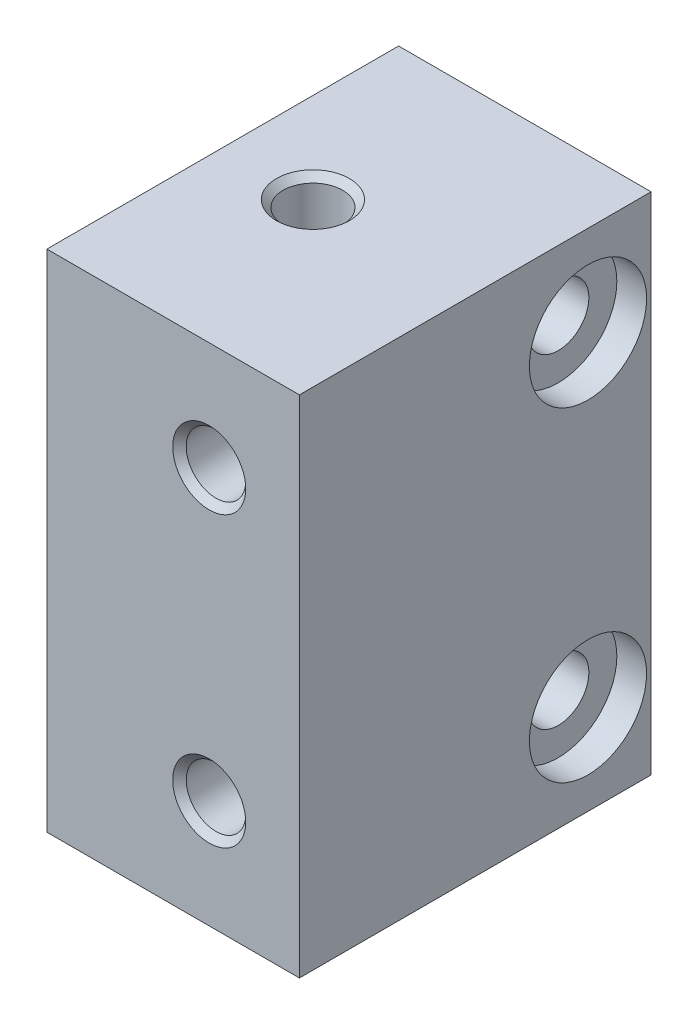
ISO-10303-21;
HEADER;
FILE_DESCRIPTION(('STEP AP214'),'2;1');
FILE_NAME('part.step','',(''),(''),'','','');
FILE_SCHEMA(('AUTOMOTIVE_DESIGN { 1 0 10303 214 1 1 1 1 }'));
ENDSEC;
DATA;
#1=APPLICATION_CONTEXT('core data for automotive mechanical design processes');
#2=APPLICATION_PROTOCOL_DEFINITION('international standard','automotive_design',2000,#1);
#3=PRODUCT_CONTEXT('',#1,'mechanical');
#4=PRODUCT('Part','Part','',(#3));
#5=PRODUCT_RELATED_PRODUCT_CATEGORY('part','',(#4));
#6=PRODUCT_DEFINITION_FORMATION('','',#4);
#7=PRODUCT_DEFINITION_CONTEXT('part definition',#1,'design');
#8=PRODUCT_DEFINITION('design','',#6,#7);
#9=PRODUCT_DEFINITION_SHAPE('','',#8);
#10=(LENGTH_UNIT() NAMED_UNIT(*) SI_UNIT(.MILLI.,.METRE.));
#11=(NAMED_UNIT(*) PLANE_ANGLE_UNIT() SI_UNIT($,.RADIAN.));
#12=(NAMED_UNIT(*) SI_UNIT($,.STERADIAN.) SOLID_ANGLE_UNIT());
#13=UNCERTAINTY_MEASURE_WITH_UNIT(LENGTH_MEASURE(1.E-05),#10,'distance_accuracy_value','');
#14=(GEOMETRIC_REPRESENTATION_CONTEXT(3) GLOBAL_UNCERTAINTY_ASSIGNED_CONTEXT((#13)) GLOBAL_UNIT_ASSIGNED_CONTEXT((#10,
#11,#12)) REPRESENTATION_CONTEXT('',''));
#15=CARTESIAN_POINT('',(0.,0.,0.));
#16=DIRECTION('',(0.,0.,1.));
#17=DIRECTION('',(1.,0.,0.));
#18=AXIS2_PLACEMENT_3D('',#15,#16,#17);
#19=CARTESIAN_POINT('',(21.9050122291573,-14.0022091203632,19.5));
#20=DIRECTION('',(-1.,0.,0.));
#21=DIRECTION('',(0.,0.,1.));
#22=AXIS2_PLACEMENT_3D('',#19,#20,#21);
#23=PLANE('',#22);
#24=CARTESIAN_POINT('',(21.9050122291573,-9.00220912036323,3.5));
#25=DIRECTION('',(1.,0.,0.));
#26=DIRECTION('',(0.,0.,-1.));
#27=AXIS2_PLACEMENT_3D('',#24,#25,#26);
#28=CIRCLE('',#27,3.25);
#29=CARTESIAN_POINT('',(21.9050122291573,-9.00220912036323,0.250000000000004));
#30=VERTEX_POINT('',#29);
#31=EDGE_CURVE('E127',#30,#30,#28,.T.);
#32=ORIENTED_EDGE('',*,*,#31,.F.);
#33=EDGE_LOOP('',(#32));
#34=FACE_BOUND('',#33,.T.);
#35=DIRECTION('',(0.,1.,0.));
#36=VECTOR('',#35,1.);
#37=CARTESIAN_POINT('',(21.9050122291573,-14.0022091203632,0.));
#38=LINE('',#37,#36);
#39=CARTESIAN_POINT('',(21.9050122291573,-14.0022091203632,0.));
#40=VERTEX_POINT('',#39);
#41=CARTESIAN_POINT('',(21.9050122291573,13.9977908796368,0.));
#42=VERTEX_POINT('',#41);
#43=EDGE_CURVE('E139',#40,#42,#38,.T.);
#44=ORIENTED_EDGE('',*,*,#43,.T.);
#45=DIRECTION('',(0.,0.,-1.));
#46=VECTOR('',#45,1.);
#47=CARTESIAN_POINT('',(21.9050122291573,13.9977908796368,19.5));
#48=LINE('',#47,#46);
#49=CARTESIAN_POINT('',(21.9050122291573,13.9977908796368,19.5));
#50=VERTEX_POINT('',#49);
#51=EDGE_CURVE('E11',#50,#42,#48,.T.);
#52=ORIENTED_EDGE('',*,*,#51,.F.);
#53=DIRECTION('',(0.,1.,0.));
#54=VECTOR('',#53,1.);
#55=CARTESIAN_POINT('',(21.9050122291573,-14.0022091203632,19.5));
#56=LINE('',#55,#54);
#57=CARTESIAN_POINT('',(21.9050122291573,-14.0022091203632,19.5));
#58=VERTEX_POINT('',#57);
#59=EDGE_CURVE('E140',#58,#50,#56,.T.);
#60=ORIENTED_EDGE('',*,*,#59,.F.);
#61=DIRECTION('',(0.,0.,-1.));
#62=VECTOR('',#61,1.);
#63=CARTESIAN_POINT('',(21.9050122291573,-14.0022091203632,19.5));
#64=LINE('',#63,#62);
#65=EDGE_CURVE('E146',#58,#40,#64,.T.);
#66=ORIENTED_EDGE('',*,*,#65,.T.);
#67=EDGE_LOOP('',(#44,#52,#60,#66));
#68=FACE_BOUND('',#67,.T.);
#69=CARTESIAN_POINT('',(21.9050122291573,8.99779087963678,3.5));
#70=DIRECTION('',(1.,0.,0.));
#71=DIRECTION('',(0.,0.,-1.));
#72=AXIS2_PLACEMENT_3D('',#69,#70,#71);
#73=CIRCLE('',#72,3.25);
#74=CARTESIAN_POINT('',(21.9050122291573,8.99779087963678,0.250000000000007));
#75=VERTEX_POINT('',#74);
#76=EDGE_CURVE('E115',#75,#75,#73,.T.);
#77=ORIENTED_EDGE('',*,*,#76,.F.);
#78=EDGE_LOOP('',(#77));
#79=FACE_BOUND('',#78,.T.);
#80=ADVANCED_FACE('F35',(#34,#68,#79),#23,.F.);
#81=CARTESIAN_POINT('',(21.9050122291573,13.9977908796368,19.5));
#82=DIRECTION('',(0.,-1.,0.));
#83=DIRECTION('',(1.,0.,0.));
#84=AXIS2_PLACEMENT_3D('',#81,#82,#83);
#85=PLANE('',#84);
#86=CARTESIAN_POINT('',(12.9050122291573,13.9977908796368,9.75));
#87=DIRECTION('',(0.,1.,0.));
#88=DIRECTION('',(0.,0.,1.));
#89=AXIS2_PLACEMENT_3D('',#86,#87,#88);
#90=CIRCLE('',#89,2.025);
#91=CARTESIAN_POINT('',(12.9050122291573,13.9977908796368,11.775));
#92=VERTEX_POINT('',#91);
#93=EDGE_CURVE('E363',#92,#92,#90,.T.);
#94=ORIENTED_EDGE('',*,*,#93,.F.);
#95=EDGE_LOOP('',(#94));
#96=FACE_BOUND('',#95,.T.);
#97=DIRECTION('',(-1.,0.,0.));
#98=VECTOR('',#97,1.);
#99=CARTESIAN_POINT('',(21.9050122291573,13.9977908796368,0.));
#100=LINE('',#99,#98);
#101=CARTESIAN_POINT('',(7.90501222915729,13.9977908796368,0.));
#102=VERTEX_POINT('',#101);
#103=EDGE_CURVE('E149',#42,#102,#100,.T.);
#104=ORIENTED_EDGE('',*,*,#103,.T.);
#105=DIRECTION('',(0.,0.,-1.));
#106=VECTOR('',#105,1.);
#107=CARTESIAN_POINT('',(7.90501222915729,13.9977908796368,19.5));
#108=LINE('',#107,#106);
#109=CARTESIAN_POINT('',(7.90501222915729,13.9977908796368,19.5));
#110=VERTEX_POINT('',#109);
#111=EDGE_CURVE('E43',#110,#102,#108,.T.);
#112=ORIENTED_EDGE('',*,*,#111,.F.);
#113=DIRECTION('',(-1.,0.,0.));
#114=VECTOR('',#113,1.);
#115=CARTESIAN_POINT('',(21.9050122291573,13.9977908796368,19.5));
#116=LINE('',#115,#114);
#117=EDGE_CURVE('E82',#50,#110,#116,.T.);
#118=ORIENTED_EDGE('',*,*,#117,.F.);
#119=ORIENTED_EDGE('',*,*,#51,.T.);
#120=EDGE_LOOP('',(#104,#112,#118,#119));
#121=FACE_BOUND('',#120,.T.);
#122=ADVANCED_FACE('F175',(#96,#121),#85,.F.);
#123=CARTESIAN_POINT('',(7.90501222915729,-14.0022091203632,19.5));
#124=DIRECTION('',(1.,0.,0.));
#125=DIRECTION('',(0.,1.,0.));
#126=AXIS2_PLACEMENT_3D('',#123,#124,#125);
#127=PLANE('',#126);
#128=CARTESIAN_POINT('',(7.90501222915729,8.99779087963678,3.5));
#129=DIRECTION('',(1.,0.,0.));
#130=DIRECTION('',(0.,1.,0.));
#131=AXIS2_PLACEMENT_3D('',#128,#129,#130);
#132=CIRCLE('',#131,1.7);
#133=CARTESIAN_POINT('',(7.90501222915729,10.6977908796368,3.5));
#134=VERTEX_POINT('',#133);
#135=EDGE_CURVE('E124',#134,#134,#132,.T.);
#136=ORIENTED_EDGE('',*,*,#135,.T.);
#137=EDGE_LOOP('',(#136));
#138=FACE_BOUND('',#137,.T.);
#139=CARTESIAN_POINT('',(7.90501222915729,-9.00220912036323,3.5));
#140=DIRECTION('',(1.,0.,0.));
#141=DIRECTION('',(0.,1.,0.));
#142=AXIS2_PLACEMENT_3D('',#139,#140,#141);
#143=CIRCLE('',#142,1.7);
#144=CARTESIAN_POINT('',(7.90501222915729,-7.30220912036323,3.5));
#145=VERTEX_POINT('',#144);
#146=EDGE_CURVE('E136',#145,#145,#143,.T.);
#147=ORIENTED_EDGE('',*,*,#146,.T.);
#148=EDGE_LOOP('',(#147));
#149=FACE_BOUND('',#148,.T.);
#150=DIRECTION('',(0.,-1.,0.));
#151=VECTOR('',#150,1.);
#152=CARTESIAN_POINT('',(7.90501222915729,-14.0022091203632,0.));
#153=LINE('',#152,#151);
#154=CARTESIAN_POINT('',(7.90501222915729,-14.0022091203632,0.));
#155=VERTEX_POINT('',#154);
#156=EDGE_CURVE('E69',#102,#155,#153,.T.);
#157=ORIENTED_EDGE('',*,*,#156,.T.);
#158=DIRECTION('',(0.,0.,-1.));
#159=VECTOR('',#158,1.);
#160=CARTESIAN_POINT('',(7.90501222915729,-14.0022091203632,19.5));
#161=LINE('',#160,#159);
#162=CARTESIAN_POINT('',(7.90501222915729,-14.0022091203632,19.5));
#163=VERTEX_POINT('',#162);
#164=EDGE_CURVE('E154',#163,#155,#161,.T.);
#165=ORIENTED_EDGE('',*,*,#164,.F.);
#166=DIRECTION('',(0.,-1.,0.));
#167=VECTOR('',#166,1.);
#168=CARTESIAN_POINT('',(7.90501222915729,-14.0022091203632,19.5));
#169=LINE('',#168,#167);
#170=EDGE_CURVE('E143',#110,#163,#169,.T.);
#171=ORIENTED_EDGE('',*,*,#170,.F.);
#172=ORIENTED_EDGE('',*,*,#111,.T.);
#173=EDGE_LOOP('',(#157,#165,#171,#172));
#174=FACE_BOUND('',#173,.T.);
#175=ADVANCED_FACE('F156',(#138,#149,#174),#127,.F.);
#176=CARTESIAN_POINT('',(21.9050122291573,-14.0022091203632,19.5));
#177=DIRECTION('',(0.,1.,0.));
#178=DIRECTION('',(-1.,0.,0.));
#179=AXIS2_PLACEMENT_3D('',#176,#177,#178);
#180=PLANE('',#179);
#181=CARTESIAN_POINT('',(12.9050122291573,-14.0022091203632,9.75));
#182=DIRECTION('',(0.,1.,0.));
#183=DIRECTION('',(0.,0.,1.));
#184=AXIS2_PLACEMENT_3D('',#181,#182,#183);
#185=CIRCLE('',#184,2.02499999999999);
#186=CARTESIAN_POINT('',(12.9050122291573,-14.0022091203632,11.775));
#187=VERTEX_POINT('',#186);
#188=EDGE_CURVE('E364',#187,#187,#185,.T.);
#189=ORIENTED_EDGE('',*,*,#188,.T.);
#190=EDGE_LOOP('',(#189));
#191=FACE_BOUND('',#190,.T.);
#192=DIRECTION('',(1.,0.,0.));
#193=VECTOR('',#192,1.);
#194=CARTESIAN_POINT('',(21.9050122291573,-14.0022091203632,0.));
#195=LINE('',#194,#193);
#196=EDGE_CURVE('E75',#155,#40,#195,.T.);
#197=ORIENTED_EDGE('',*,*,#196,.T.);
#198=ORIENTED_EDGE('',*,*,#65,.F.);
#199=DIRECTION('',(1.,0.,0.));
#200=VECTOR('',#199,1.);
#201=CARTESIAN_POINT('',(21.9050122291573,-14.0022091203632,19.5));
#202=LINE('',#201,#200);
#203=EDGE_CURVE('E51',#163,#58,#202,.T.);
#204=ORIENTED_EDGE('',*,*,#203,.F.);
#205=ORIENTED_EDGE('',*,*,#164,.T.);
#206=EDGE_LOOP('',(#197,#198,#204,#205));
#207=FACE_BOUND('',#206,.T.);
#208=ADVANCED_FACE('F164',(#191,#207),#180,.F.);
#209=CARTESIAN_POINT('',(0.,0.,19.5));
#210=DIRECTION('',(0.,0.,1.));
#211=DIRECTION('',(1.,0.,0.));
#212=AXIS2_PLACEMENT_3D('',#209,#210,#211);
#213=PLANE('',#212);
#214=CARTESIAN_POINT('',(16.9050122291573,7.99779087963677,19.5));
#215=DIRECTION('',(0.,0.,1.));
#216=DIRECTION('',(1.,0.,0.));
#217=AXIS2_PLACEMENT_3D('',#214,#215,#216);
#218=CIRCLE('',#217,2.025);
#219=CARTESIAN_POINT('',(18.9300122291573,7.99779087963677,19.5));
#220=VERTEX_POINT('',#219);
#221=EDGE_CURVE('E106',#220,#220,#218,.T.);
#222=ORIENTED_EDGE('',*,*,#221,.F.);
#223=EDGE_LOOP('',(#222));
#224=FACE_BOUND('',#223,.T.);
#225=CARTESIAN_POINT('',(16.9050122291573,-8.00220912036323,19.5));
#226=DIRECTION('',(0.,0.,1.));
#227=DIRECTION('',(1.,0.,0.));
#228=AXIS2_PLACEMENT_3D('',#225,#226,#227);
#229=CIRCLE('',#228,2.025);
#230=CARTESIAN_POINT('',(18.9300122291573,-8.00220912036323,19.5));
#231=VERTEX_POINT('',#230);
#232=EDGE_CURVE('E99',#231,#231,#229,.T.);
#233=ORIENTED_EDGE('',*,*,#232,.F.);
#234=EDGE_LOOP('',(#233));
#235=FACE_BOUND('',#234,.T.);
#236=ORIENTED_EDGE('',*,*,#59,.T.);
#237=ORIENTED_EDGE('',*,*,#117,.T.);
#238=ORIENTED_EDGE('',*,*,#170,.T.);
#239=ORIENTED_EDGE('',*,*,#203,.T.);
#240=EDGE_LOOP('',(#236,#237,#238,#239));
#241=FACE_BOUND('',#240,.T.);
#242=ADVANCED_FACE('F166',(#224,#235,#241),#213,.T.);
#243=CARTESIAN_POINT('',(0.,0.,0.));
#244=DIRECTION('',(0.,0.,1.));
#245=DIRECTION('',(1.,0.,0.));
#246=AXIS2_PLACEMENT_3D('',#243,#244,#245);
#247=PLANE('',#246);
#248=ORIENTED_EDGE('',*,*,#43,.F.);
#249=ORIENTED_EDGE('',*,*,#196,.F.);
#250=ORIENTED_EDGE('',*,*,#156,.F.);
#251=ORIENTED_EDGE('',*,*,#103,.F.);
#252=EDGE_LOOP('',(#248,#249,#250,#251));
#253=FACE_BOUND('',#252,.T.);
#254=ADVANCED_FACE('F159',(#253),#247,.F.);
#255=CARTESIAN_POINT('',(21.9050122291573,-9.00220912036323,3.5));
#256=DIRECTION('',(1.,0.,0.));
#257=DIRECTION('',(0.,0.,-1.));
#258=AXIS2_PLACEMENT_3D('',#255,#256,#257);
#259=CYLINDRICAL_SURFACE('',#258,1.7);
#260=ORIENTED_EDGE('',*,*,#146,.F.);
#261=EDGE_LOOP('',(#260));
#262=FACE_BOUND('',#261,.T.);
#263=CARTESIAN_POINT('',(20.2550122291573,-9.00220912036323,3.5));
#264=DIRECTION('',(1.,0.,0.));
#265=DIRECTION('',(0.,0.,-1.));
#266=AXIS2_PLACEMENT_3D('',#263,#264,#265);
#267=CIRCLE('',#266,1.7);
#268=CARTESIAN_POINT('',(20.2550122291573,-9.00220912036323,1.8));
#269=VERTEX_POINT('',#268);
#270=EDGE_CURVE('E133',#269,#269,#267,.T.);
#271=ORIENTED_EDGE('',*,*,#270,.T.);
#272=EDGE_LOOP('',(#271));
#273=FACE_BOUND('',#272,.T.);
#274=ADVANCED_FACE('F201',(#262,#273),#259,.F.);
#275=CARTESIAN_POINT('',(20.2550122291573,-7.30220912036323,3.5));
#276=DIRECTION('',(-1.,0.,0.));
#277=DIRECTION('',(0.,0.,1.));
#278=AXIS2_PLACEMENT_3D('',#275,#276,#277);
#279=PLANE('',#278);
#280=ORIENTED_EDGE('',*,*,#270,.F.);
#281=EDGE_LOOP('',(#280));
#282=FACE_BOUND('',#281,.T.);
#283=CARTESIAN_POINT('',(20.2550122291573,-9.00220912036323,3.5));
#284=DIRECTION('',(1.,0.,0.));
#285=DIRECTION('',(0.,0.,-1.));
#286=AXIS2_PLACEMENT_3D('',#283,#284,#285);
#287=CIRCLE('',#286,3.25);
#288=CARTESIAN_POINT('',(20.2550122291573,-9.00220912036323,0.250000000000004));
#289=VERTEX_POINT('',#288);
#290=EDGE_CURVE('E130',#289,#289,#287,.T.);
#291=ORIENTED_EDGE('',*,*,#290,.T.);
#292=EDGE_LOOP('',(#291));
#293=FACE_BOUND('',#292,.T.);
#294=ADVANCED_FACE('F191',(#282,#293),#279,.F.);
#295=CARTESIAN_POINT('',(21.9050122291573,-9.00220912036323,3.5));
#296=DIRECTION('',(1.,0.,0.));
#297=DIRECTION('',(0.,0.,-1.));
#298=AXIS2_PLACEMENT_3D('',#295,#296,#297);
#299=CYLINDRICAL_SURFACE('',#298,3.25);
#300=ORIENTED_EDGE('',*,*,#290,.F.);
#301=EDGE_LOOP('',(#300));
#302=FACE_BOUND('',#301,.T.);
#303=ORIENTED_EDGE('',*,*,#31,.T.);
#304=EDGE_LOOP('',(#303));
#305=FACE_BOUND('',#304,.T.);
#306=ADVANCED_FACE('F188',(#302,#305),#299,.F.);
#307=CARTESIAN_POINT('',(21.9050122291573,8.99779087963678,3.5));
#308=DIRECTION('',(1.,0.,0.));
#309=DIRECTION('',(0.,0.,-1.));
#310=AXIS2_PLACEMENT_3D('',#307,#308,#309);
#311=CYLINDRICAL_SURFACE('',#310,1.7);
#312=ORIENTED_EDGE('',*,*,#135,.F.);
#313=EDGE_LOOP('',(#312));
#314=FACE_BOUND('',#313,.T.);
#315=CARTESIAN_POINT('',(20.2550122291573,8.99779087963678,3.5));
#316=DIRECTION('',(1.,0.,0.));
#317=DIRECTION('',(0.,0.,-1.));
#318=AXIS2_PLACEMENT_3D('',#315,#316,#317);
#319=CIRCLE('',#318,1.7);
#320=CARTESIAN_POINT('',(20.2550122291573,8.99779087963678,1.8));
#321=VERTEX_POINT('',#320);
#322=EDGE_CURVE('E121',#321,#321,#319,.T.);
#323=ORIENTED_EDGE('',*,*,#322,.T.);
#324=EDGE_LOOP('',(#323));
#325=FACE_BOUND('',#324,.T.);
#326=ADVANCED_FACE('F190',(#314,#325),#311,.F.);
#327=CARTESIAN_POINT('',(20.2550122291573,10.6977908796368,3.5));
#328=DIRECTION('',(-1.,0.,0.));
#329=DIRECTION('',(0.,0.,1.));
#330=AXIS2_PLACEMENT_3D('',#327,#328,#329);
#331=PLANE('',#330);
#332=ORIENTED_EDGE('',*,*,#322,.F.);
#333=EDGE_LOOP('',(#332));
#334=FACE_BOUND('',#333,.T.);
#335=CARTESIAN_POINT('',(20.2550122291573,8.99779087963678,3.5));
#336=DIRECTION('',(1.,0.,0.));
#337=DIRECTION('',(0.,0.,-1.));
#338=AXIS2_PLACEMENT_3D('',#335,#336,#337);
#339=CIRCLE('',#338,3.25);
#340=CARTESIAN_POINT('',(20.2550122291573,8.99779087963678,0.250000000000007));
#341=VERTEX_POINT('',#340);
#342=EDGE_CURVE('E118',#341,#341,#339,.T.);
#343=ORIENTED_EDGE('',*,*,#342,.T.);
#344=EDGE_LOOP('',(#343));
#345=FACE_BOUND('',#344,.T.);
#346=ADVANCED_FACE('F198',(#334,#345),#331,.F.);
#347=CARTESIAN_POINT('',(21.9050122291573,8.99779087963678,3.5));
#348=DIRECTION('',(1.,0.,0.));
#349=DIRECTION('',(0.,0.,-1.));
#350=AXIS2_PLACEMENT_3D('',#347,#348,#349);
#351=CYLINDRICAL_SURFACE('',#350,3.25);
#352=ORIENTED_EDGE('',*,*,#342,.F.);
#353=EDGE_LOOP('',(#352));
#354=FACE_BOUND('',#353,.T.);
#355=ORIENTED_EDGE('',*,*,#76,.T.);
#356=EDGE_LOOP('',(#355));
#357=FACE_BOUND('',#356,.T.);
#358=ADVANCED_FACE('F242',(#354,#357),#351,.F.);
#359=CARTESIAN_POINT('',(16.9050122291573,-8.00220912036323,8.));
#360=DIRECTION('',(0.,0.,1.));
#361=DIRECTION('',(1.,0.,0.));
#362=AXIS2_PLACEMENT_3D('',#359,#360,#361);
#363=CONICAL_SURFACE('',#362,1.65,1.02974425867665);
#364=CARTESIAN_POINT('',(16.9050122291573,-8.00220912036323,7.00857997860452));
#365=VERTEX_POINT('',#364);
#366=VERTEX_LOOP('',#365);
#367=FACE_BOUND('',#366,.T.);
#368=CARTESIAN_POINT('',(16.9050122291573,-8.00220912036323,8.));
#369=DIRECTION('',(0.,0.,1.));
#370=DIRECTION('',(1.,0.,0.));
#371=AXIS2_PLACEMENT_3D('',#368,#369,#370);
#372=CIRCLE('',#371,1.65);
#373=CARTESIAN_POINT('',(18.5550122291573,-8.00220912036323,8.));
#374=VERTEX_POINT('',#373);
#375=EDGE_CURVE('E112',#374,#374,#372,.T.);
#376=ORIENTED_EDGE('',*,*,#375,.T.);
#377=EDGE_LOOP('',(#376));
#378=FACE_BOUND('',#377,.T.);
#379=ADVANCED_FACE('F250',(#367,#378),#363,.F.);
#380=CARTESIAN_POINT('',(16.9050122291573,-8.00220912036323,19.5));
#381=DIRECTION('',(0.,0.,1.));
#382=DIRECTION('',(1.,0.,0.));
#383=AXIS2_PLACEMENT_3D('',#380,#381,#382);
#384=CYLINDRICAL_SURFACE('',#383,1.64999999999999);
#385=ORIENTED_EDGE('',*,*,#375,.F.);
#386=EDGE_LOOP('',(#385));
#387=FACE_BOUND('',#386,.T.);
#388=CARTESIAN_POINT('',(16.9050122291573,-8.00220912036323,19.125));
#389=DIRECTION('',(0.,0.,1.));
#390=DIRECTION('',(1.,0.,0.));
#391=AXIS2_PLACEMENT_3D('',#388,#389,#390);
#392=CIRCLE('',#391,1.64999999999999);
#393=CARTESIAN_POINT('',(18.5550122291573,-8.00220912036323,19.125));
#394=VERTEX_POINT('',#393);
#395=EDGE_CURVE('E103',#394,#394,#392,.T.);
#396=ORIENTED_EDGE('',*,*,#395,.T.);
#397=EDGE_LOOP('',(#396));
#398=FACE_BOUND('',#397,.T.);
#399=ADVANCED_FACE('F266',(#387,#398),#384,.F.);
#400=CARTESIAN_POINT('',(16.9050122291573,-8.00220912036323,19.5));
#401=DIRECTION('',(0.,0.,1.));
#402=DIRECTION('',(1.,0.,0.));
#403=AXIS2_PLACEMENT_3D('',#400,#401,#402);
#404=CONICAL_SURFACE('',#403,2.025,0.785398163397458);
#405=ORIENTED_EDGE('',*,*,#395,.F.);
#406=EDGE_LOOP('',(#405));
#407=FACE_BOUND('',#406,.T.);
#408=ORIENTED_EDGE('',*,*,#232,.T.);
#409=EDGE_LOOP('',(#408));
#410=FACE_BOUND('',#409,.T.);
#411=ADVANCED_FACE('F93',(#407,#410),#404,.F.);
#412=CARTESIAN_POINT('',(16.9050122291573,7.99779087963677,8.));
#413=DIRECTION('',(0.,0.,1.));
#414=DIRECTION('',(1.,0.,0.));
#415=AXIS2_PLACEMENT_3D('',#412,#413,#414);
#416=CONICAL_SURFACE('',#415,1.65,1.02974425867665);
#417=CARTESIAN_POINT('',(16.9050122291573,7.99779087963677,7.00857997860452));
#418=VERTEX_POINT('',#417);
#419=VERTEX_LOOP('',#418);
#420=FACE_BOUND('',#419,.T.);
#421=CARTESIAN_POINT('',(16.9050122291573,7.99779087963677,8.));
#422=DIRECTION('',(0.,0.,1.));
#423=DIRECTION('',(1.,0.,0.));
#424=AXIS2_PLACEMENT_3D('',#421,#422,#423);
#425=CIRCLE('',#424,1.65);
#426=CARTESIAN_POINT('',(18.5550122291573,7.99779087963677,8.));
#427=VERTEX_POINT('',#426);
#428=EDGE_CURVE('E97',#427,#427,#425,.T.);
#429=ORIENTED_EDGE('',*,*,#428,.T.);
#430=EDGE_LOOP('',(#429));
#431=FACE_BOUND('',#430,.T.);
#432=ADVANCED_FACE('F89',(#420,#431),#416,.F.);
#433=CARTESIAN_POINT('',(16.9050122291573,7.99779087963677,19.5));
#434=DIRECTION('',(0.,0.,1.));
#435=DIRECTION('',(1.,0.,0.));
#436=AXIS2_PLACEMENT_3D('',#433,#434,#435);
#437=CYLINDRICAL_SURFACE('',#436,1.64999999999999);
#438=ORIENTED_EDGE('',*,*,#428,.F.);
#439=EDGE_LOOP('',(#438));
#440=FACE_BOUND('',#439,.T.);
#441=CARTESIAN_POINT('',(16.9050122291573,7.99779087963677,19.125));
#442=DIRECTION('',(0.,0.,1.));
#443=DIRECTION('',(1.,0.,0.));
#444=AXIS2_PLACEMENT_3D('',#441,#442,#443);
#445=CIRCLE('',#444,1.64999999999999);
#446=CARTESIAN_POINT('',(18.5550122291573,7.99779087963677,19.125));
#447=VERTEX_POINT('',#446);
#448=EDGE_CURVE('E100',#447,#447,#445,.T.);
#449=ORIENTED_EDGE('',*,*,#448,.T.);
#450=EDGE_LOOP('',(#449));
#451=FACE_BOUND('',#450,.T.);
#452=ADVANCED_FACE('F92',(#440,#451),#437,.F.);
#453=CARTESIAN_POINT('',(16.9050122291573,7.99779087963677,19.5));
#454=DIRECTION('',(0.,0.,1.));
#455=DIRECTION('',(1.,0.,0.));
#456=AXIS2_PLACEMENT_3D('',#453,#454,#455);
#457=CONICAL_SURFACE('',#456,2.025,0.785398163397453);
#458=ORIENTED_EDGE('',*,*,#448,.F.);
#459=EDGE_LOOP('',(#458));
#460=FACE_BOUND('',#459,.T.);
#461=ORIENTED_EDGE('',*,*,#221,.T.);
#462=EDGE_LOOP('',(#461));
#463=FACE_BOUND('',#462,.T.);
#464=ADVANCED_FACE('F303',(#460,#463),#457,.F.);
#465=CARTESIAN_POINT('',(12.9050122291573,-13.6272091203632,9.75));
#466=DIRECTION('',(0.,-1.,0.));
#467=DIRECTION('',(0.,0.,-1.));
#468=AXIS2_PLACEMENT_3D('',#465,#466,#467);
#469=CONICAL_SURFACE('',#468,1.64999999999999,0.785398163397448);
#470=ORIENTED_EDGE('',*,*,#188,.F.);
#471=EDGE_LOOP('',(#470));
#472=FACE_BOUND('',#471,.T.);
#473=CARTESIAN_POINT('',(12.9050122291573,-13.6272091203632,9.75));
#474=DIRECTION('',(0.,1.,0.));
#475=DIRECTION('',(0.,0.,1.));
#476=AXIS2_PLACEMENT_3D('',#473,#474,#475);
#477=CIRCLE('',#476,1.64999999999999);
#478=CARTESIAN_POINT('',(12.9050122291573,-13.6272091203632,11.4));
#479=VERTEX_POINT('',#478);
#480=EDGE_CURVE('E366',#479,#479,#477,.T.);
#481=ORIENTED_EDGE('',*,*,#480,.T.);
#482=EDGE_LOOP('',(#481));
#483=FACE_BOUND('',#482,.T.);
#484=ADVANCED_FACE('F312',(#472,#483),#469,.F.);
#485=CARTESIAN_POINT('',(12.9050122291573,13.9977908796368,9.75));
#486=DIRECTION('',(0.,1.,0.));
#487=DIRECTION('',(0.,0.,1.));
#488=AXIS2_PLACEMENT_3D('',#485,#486,#487);
#489=CYLINDRICAL_SURFACE('',#488,1.65);
#490=ORIENTED_EDGE('',*,*,#480,.F.);
#491=EDGE_LOOP('',(#490));
#492=FACE_BOUND('',#491,.T.);
#493=CARTESIAN_POINT('',(12.9050122291573,13.6227908796368,9.75));
#494=DIRECTION('',(0.,1.,0.));
#495=DIRECTION('',(0.,0.,1.));
#496=AXIS2_PLACEMENT_3D('',#493,#494,#495);
#497=CIRCLE('',#496,1.65);
#498=CARTESIAN_POINT('',(12.9050122291573,13.6227908796368,11.4));
#499=VERTEX_POINT('',#498);
#500=EDGE_CURVE('E360',#499,#499,#497,.T.);
#501=ORIENTED_EDGE('',*,*,#500,.T.);
#502=EDGE_LOOP('',(#501));
#503=FACE_BOUND('',#502,.T.);
#504=ADVANCED_FACE('F332',(#492,#503),#489,.F.);
#505=CARTESIAN_POINT('',(12.9050122291573,13.9977908796368,9.75));
#506=DIRECTION('',(0.,1.,0.));
#507=DIRECTION('',(0.,0.,1.));
#508=AXIS2_PLACEMENT_3D('',#505,#506,#507);
#509=CONICAL_SURFACE('',#508,2.025,0.785398163397444);
#510=ORIENTED_EDGE('',*,*,#500,.F.);
#511=EDGE_LOOP('',(#510));
#512=FACE_BOUND('',#511,.T.);
#513=ORIENTED_EDGE('',*,*,#93,.T.);
#514=EDGE_LOOP('',(#513));
#515=FACE_BOUND('',#514,.T.);
#516=ADVANCED_FACE('F342',(#512,#515),#509,.F.);
#517=CLOSED_SHELL('',(#80,#122,#175,#208,#242,#254,#274,#294,#306,#326,#346,#358,#379,#399,#411,
#432,#452,#464,#484,#504,#516));
#518=MANIFOLD_SOLID_BREP('B2',#517);
#519=ADVANCED_BREP_SHAPE_REPRESENTATION('',(#18,#518),#14);
#520=SHAPE_DEFINITION_REPRESENTATION(#9,#519);
ENDSEC;
END-ISO-10303-21;
